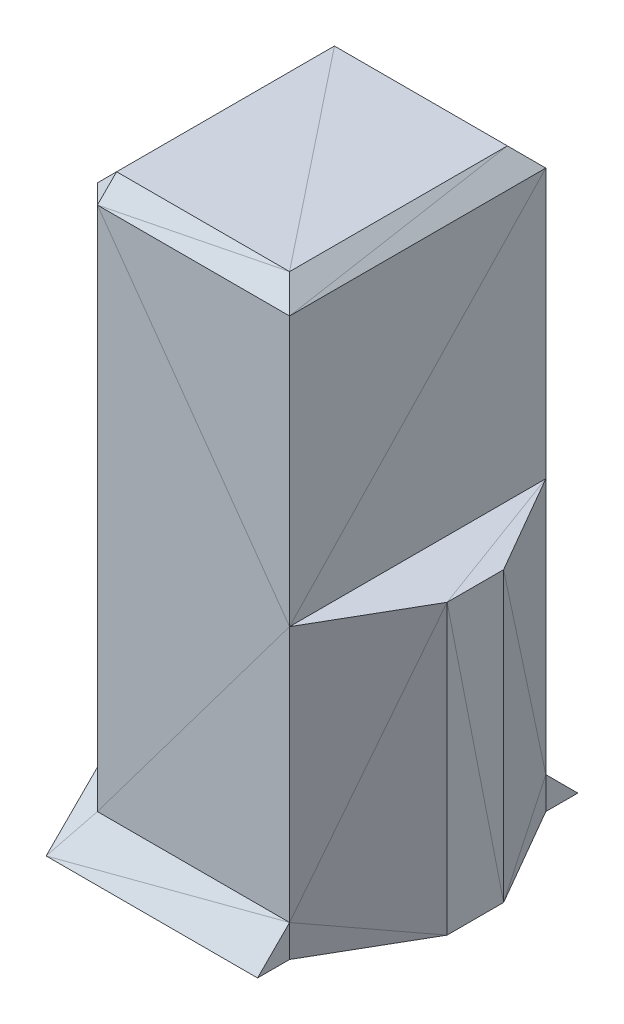
ISO-10303-21;
HEADER;
FILE_DESCRIPTION(('STEP AP214'),'2;1');
FILE_NAME('part.step','',(''),(''),'','','');
FILE_SCHEMA(('AUTOMOTIVE_DESIGN { 1 0 10303 214 1 1 1 1 }'));
ENDSEC;
DATA;
#1=APPLICATION_CONTEXT('core data for automotive mechanical design processes');
#2=APPLICATION_PROTOCOL_DEFINITION('international standard','automotive_design',2000,#1);
#3=PRODUCT_CONTEXT('',#1,'mechanical');
#4=PRODUCT('Part','Part','',(#3));
#5=PRODUCT_RELATED_PRODUCT_CATEGORY('part','',(#4));
#6=PRODUCT_DEFINITION_FORMATION('','',#4);
#7=PRODUCT_DEFINITION_CONTEXT('part definition',#1,'design');
#8=PRODUCT_DEFINITION('design','',#6,#7);
#9=PRODUCT_DEFINITION_SHAPE('','',#8);
#10=(LENGTH_UNIT() NAMED_UNIT(*) SI_UNIT(.MILLI.,.METRE.));
#11=(NAMED_UNIT(*) PLANE_ANGLE_UNIT() SI_UNIT($,.RADIAN.));
#12=(NAMED_UNIT(*) SI_UNIT($,.STERADIAN.) SOLID_ANGLE_UNIT());
#13=UNCERTAINTY_MEASURE_WITH_UNIT(LENGTH_MEASURE(1.E-05),#10,'distance_accuracy_value','');
#14=(GEOMETRIC_REPRESENTATION_CONTEXT(3) GLOBAL_UNCERTAINTY_ASSIGNED_CONTEXT((#13)) GLOBAL_UNIT_ASSIGNED_CONTEXT((#10,
#11,#12)) REPRESENTATION_CONTEXT('',''));
#15=CARTESIAN_POINT('',(0.,0.,0.));
#16=DIRECTION('',(0.,0.,1.));
#17=DIRECTION('',(1.,0.,0.));
#18=AXIS2_PLACEMENT_3D('',#15,#16,#17);
#19=CARTESIAN_POINT('',(-2.1,4.199999809265,-1.699999809265));
#20=DIRECTION('',(-0.707107062164992,0.707106500207992,0.));
#21=DIRECTION('',(0.,0.,1.));
#22=AXIS2_PLACEMENT_3D('',#19,#20,#21);
#23=PLANE('',#22);
#24=DIRECTION('',(-0.0875562486919108,-0.0875563182753708,-0.992304285209462));
#25=VECTOR('',#24,1.);
#26=CARTESIAN_POINT('',(-1.800000047684,4.5,1.700000107288));
#27=LINE('',#26,#25);
#28=CARTESIAN_POINT('',(-1.800000047684,4.5,1.700000107288));
#29=VERTEX_POINT('',#28);
#30=CARTESIAN_POINT('',(-2.1,4.199999809265,-1.699999809265));
#31=VERTEX_POINT('',#30);
#32=EDGE_CURVE('E10',#29,#31,#27,.T.);
#33=ORIENTED_EDGE('',*,*,#32,.F.);
#34=DIRECTION('',(0.,0.,1.));
#35=VECTOR('',#34,1.);
#36=CARTESIAN_POINT('',(-1.800000047684,4.5,-1.699999809265));
#37=LINE('',#36,#35);
#38=CARTESIAN_POINT('',(-1.800000047684,4.5,-1.699999809265));
#39=VERTEX_POINT('',#38);
#40=EDGE_CURVE('E272',#39,#29,#37,.T.);
#41=ORIENTED_EDGE('',*,*,#40,.F.);
#42=DIRECTION('',(0.707106500207992,0.707107062164992,0.));
#43=VECTOR('',#42,1.);
#44=CARTESIAN_POINT('',(-2.1,4.199999809265,-1.699999809265));
#45=LINE('',#44,#43);
#46=EDGE_CURVE('E38',#31,#39,#45,.T.);
#47=ORIENTED_EDGE('',*,*,#46,.F.);
#48=EDGE_LOOP('',(#33,#41,#47));
#49=FACE_BOUND('',#48,.T.);
#50=ADVANCED_FACE('F16',(#49),#23,.T.);
#51=CARTESIAN_POINT('',(-2.1,4.199999809265,1.700000107288));
#52=DIRECTION('',(-0.707107062164992,0.707106500207992,0.));
#53=DIRECTION('',(0.,0.,1.));
#54=AXIS2_PLACEMENT_3D('',#51,#52,#53);
#55=PLANE('',#54);
#56=DIRECTION('',(-0.707106500207992,-0.707107062164992,0.));
#57=VECTOR('',#56,1.);
#58=CARTESIAN_POINT('',(-1.800000047684,4.5,1.700000107288));
#59=LINE('',#58,#57);
#60=CARTESIAN_POINT('',(-2.1,4.199999809265,1.700000107288));
#61=VERTEX_POINT('',#60);
#62=EDGE_CURVE('E24',#29,#61,#59,.T.);
#63=ORIENTED_EDGE('',*,*,#62,.F.);
#64=ORIENTED_EDGE('',*,*,#32,.T.);
#65=DIRECTION('',(0.,0.,-1.));
#66=VECTOR('',#65,1.);
#67=CARTESIAN_POINT('',(-2.1,4.199999809265,1.700000107288));
#68=LINE('',#67,#66);
#69=EDGE_CURVE('E182',#61,#31,#68,.T.);
#70=ORIENTED_EDGE('',*,*,#69,.F.);
#71=EDGE_LOOP('',(#63,#64,#70));
#72=FACE_BOUND('',#71,.T.);
#73=ADVANCED_FACE('F189',(#72),#55,.T.);
#74=CARTESIAN_POINT('',(-1.800000047684,4.199999809265,2.000000149012));
#75=DIRECTION('',(-0.577350479489928,0.577350020652928,0.577350307425928));
#76=DIRECTION('',(0.707106500207351,0.707107062165632,0.));
#77=AXIS2_PLACEMENT_3D('',#74,#75,#76);
#78=PLANE('',#77);
#79=DIRECTION('',(0.,-0.707106956798026,0.707106605575026));
#80=VECTOR('',#79,1.);
#81=CARTESIAN_POINT('',(-1.800000047684,4.5,1.700000107288));
#82=LINE('',#81,#80);
#83=CARTESIAN_POINT('',(-1.800000047684,4.199999809265,2.000000149012));
#84=VERTEX_POINT('',#83);
#85=EDGE_CURVE('E154',#29,#84,#82,.T.);
#86=ORIENTED_EDGE('',*,*,#85,.F.);
#87=ORIENTED_EDGE('',*,*,#62,.T.);
#88=DIRECTION('',(-0.70710667581904,0.,-0.70710688655404));
#89=VECTOR('',#88,1.);
#90=CARTESIAN_POINT('',(-1.800000047684,4.199999809265,2.000000149012));
#91=LINE('',#90,#89);
#92=EDGE_CURVE('E155',#84,#61,#91,.T.);
#93=ORIENTED_EDGE('',*,*,#92,.F.);
#94=EDGE_LOOP('',(#86,#87,#93));
#95=FACE_BOUND('',#94,.T.);
#96=ADVANCED_FACE('F147',(#95),#78,.T.);
#97=CARTESIAN_POINT('',(-1.800000047684,4.199999809265,-2.));
#98=DIRECTION('',(-0.577350575080919,0.577350116243919,-0.577350116243919));
#99=DIRECTION('',(-0.707106500207398,0.,0.707107062165586));
#100=AXIS2_PLACEMENT_3D('',#97,#98,#99);
#101=PLANE('',#100);
#102=DIRECTION('',(0.707106500207992,0.,-0.707107062164992));
#103=VECTOR('',#102,1.);
#104=CARTESIAN_POINT('',(-2.1,4.199999809265,-1.699999809265));
#105=LINE('',#104,#103);
#106=CARTESIAN_POINT('',(-1.800000047684,4.199999809265,-2.));
#107=VERTEX_POINT('',#106);
#108=EDGE_CURVE('E290',#31,#107,#105,.T.);
#109=ORIENTED_EDGE('',*,*,#108,.F.);
#110=ORIENTED_EDGE('',*,*,#46,.T.);
#111=DIRECTION('',(0.,0.707106781186548,0.707106781186548));
#112=VECTOR('',#111,1.);
#113=CARTESIAN_POINT('',(-1.800000047684,4.199999809265,-2.));
#114=LINE('',#113,#112);
#115=EDGE_CURVE('E234',#107,#39,#114,.T.);
#116=ORIENTED_EDGE('',*,*,#115,.F.);
#117=EDGE_LOOP('',(#109,#110,#116));
#118=FACE_BOUND('',#117,.T.);
#119=ADVANCED_FACE('F548',(#118),#101,.T.);
#120=CARTESIAN_POINT('',(-1.800000047684,-4.,2.000000149012));
#121=DIRECTION('',(-0.70710688655404,0.,0.70710667581904));
#122=DIRECTION('',(0.,1.,0.));
#123=AXIS2_PLACEMENT_3D('',#120,#121,#122);
#124=PLANE('',#123);
#125=DIRECTION('',(0.0365364898834429,-0.99866419231808,0.036536500772163));
#126=VECTOR('',#125,1.);
#127=CARTESIAN_POINT('',(-2.1,4.199999809265,1.700000107288));
#128=LINE('',#127,#126);
#129=CARTESIAN_POINT('',(-1.800000047684,-4.,2.000000149012));
#130=VERTEX_POINT('',#129);
#131=EDGE_CURVE('E162',#61,#130,#128,.T.);
#132=ORIENTED_EDGE('',*,*,#131,.F.);
#133=DIRECTION('',(0.,1.,0.));
#134=VECTOR('',#133,1.);
#135=CARTESIAN_POINT('',(-2.1,-3.700000047684,1.700000107288));
#136=LINE('',#135,#134);
#137=CARTESIAN_POINT('',(-2.1,-3.700000047684,1.700000107288));
#138=VERTEX_POINT('',#137);
#139=EDGE_CURVE('E167',#138,#61,#136,.T.);
#140=ORIENTED_EDGE('',*,*,#139,.F.);
#141=DIRECTION('',(-0.577350211834954,0.577350211834954,-0.577350383898953));
#142=VECTOR('',#141,1.);
#143=CARTESIAN_POINT('',(-1.800000047684,-4.,2.000000149012));
#144=LINE('',#143,#142);
#145=EDGE_CURVE('E169',#130,#138,#144,.T.);
#146=ORIENTED_EDGE('',*,*,#145,.F.);
#147=EDGE_LOOP('',(#132,#140,#146));
#148=FACE_BOUND('',#147,.T.);
#149=ADVANCED_FACE('F163',(#148),#124,.T.);
#150=CARTESIAN_POINT('',(-1.800000047684,4.199999809265,2.000000149012));
#151=DIRECTION('',(-0.70710688655404,0.,0.70710667581904));
#152=DIRECTION('',(0.,1.,0.));
#153=AXIS2_PLACEMENT_3D('',#150,#151,#152);
#154=PLANE('',#153);
#155=ORIENTED_EDGE('',*,*,#92,.T.);
#156=ORIENTED_EDGE('',*,*,#131,.T.);
#157=DIRECTION('',(0.,-1.,0.));
#158=VECTOR('',#157,1.);
#159=CARTESIAN_POINT('',(-1.800000047684,4.199999809265,2.000000149012));
#160=LINE('',#159,#158);
#161=EDGE_CURVE('E176',#84,#130,#160,.T.);
#162=ORIENTED_EDGE('',*,*,#161,.F.);
#163=EDGE_LOOP('',(#155,#156,#162));
#164=FACE_BOUND('',#163,.T.);
#165=ADVANCED_FACE('F173',(#164),#154,.T.);
#166=CARTESIAN_POINT('',(0.9,4.5,1.700000107288));
#167=DIRECTION('',(0.,0.707106605575026,0.707106956798026));
#168=DIRECTION('',(1.,0.,0.));
#169=AXIS2_PLACEMENT_3D('',#166,#167,#168);
#170=PLANE('',#169);
#171=DIRECTION('',(0.987878331105138,0.109764326859015,-0.109764272339015));
#172=VECTOR('',#171,1.);
#173=CARTESIAN_POINT('',(-1.800000047684,4.199999809265,2.000000149012));
#174=LINE('',#173,#172);
#175=CARTESIAN_POINT('',(0.9,4.5,1.700000107288));
#176=VERTEX_POINT('',#175);
#177=EDGE_CURVE('E177',#84,#176,#174,.T.);
#178=ORIENTED_EDGE('',*,*,#177,.F.);
#179=DIRECTION('',(-1.,0.,0.));
#180=VECTOR('',#179,1.);
#181=CARTESIAN_POINT('',(1.199999952316,4.199999809265,2.000000149012));
#182=LINE('',#181,#180);
#183=CARTESIAN_POINT('',(1.199999952316,4.199999809265,2.000000149012));
#184=VERTEX_POINT('',#183);
#185=EDGE_CURVE('E320',#184,#84,#182,.T.);
#186=ORIENTED_EDGE('',*,*,#185,.F.);
#187=DIRECTION('',(0.577350058889262,-0.577350517726261,0.577350230953261));
#188=VECTOR('',#187,1.);
#189=CARTESIAN_POINT('',(0.9,4.5,1.700000107288));
#190=LINE('',#189,#188);
#191=EDGE_CURVE('E378',#176,#184,#190,.T.);
#192=ORIENTED_EDGE('',*,*,#191,.F.);
#193=EDGE_LOOP('',(#178,#186,#192));
#194=FACE_BOUND('',#193,.T.);
#195=ADVANCED_FACE('F409',(#194),#170,.T.);
#196=CARTESIAN_POINT('',(-1.800000047684,4.5,1.700000107288));
#197=DIRECTION('',(0.,0.707106605575026,0.707106956798026));
#198=DIRECTION('',(1.,0.,0.));
#199=AXIS2_PLACEMENT_3D('',#196,#197,#198);
#200=PLANE('',#199);
#201=ORIENTED_EDGE('',*,*,#85,.T.);
#202=ORIENTED_EDGE('',*,*,#177,.T.);
#203=DIRECTION('',(1.,0.,0.));
#204=VECTOR('',#203,1.);
#205=CARTESIAN_POINT('',(-1.800000047684,4.5,1.700000107288));
#206=LINE('',#205,#204);
#207=EDGE_CURVE('E273',#29,#176,#206,.T.);
#208=ORIENTED_EDGE('',*,*,#207,.F.);
#209=EDGE_LOOP('',(#201,#202,#208));
#210=FACE_BOUND('',#209,.T.);
#211=ADVANCED_FACE('F399',(#210),#200,.T.);
#212=CARTESIAN_POINT('',(1.199999952316,4.199999809265,-2.));
#213=DIRECTION('',(0.,0.707106781186548,-0.707106781186548));
#214=DIRECTION('',(-1.,0.,0.));
#215=AXIS2_PLACEMENT_3D('',#212,#213,#214);
#216=PLANE('',#215);
#217=DIRECTION('',(0.990147530633161,-0.0990148160152161,-0.0990148160152161));
#218=VECTOR('',#217,1.);
#219=CARTESIAN_POINT('',(-1.800000047684,4.5,-1.699999809265));
#220=LINE('',#219,#218);
#221=CARTESIAN_POINT('',(1.199999952316,4.199999809265,-2.));
#222=VERTEX_POINT('',#221);
#223=EDGE_CURVE('E237',#39,#222,#220,.T.);
#224=ORIENTED_EDGE('',*,*,#223,.F.);
#225=DIRECTION('',(-1.,0.,0.));
#226=VECTOR('',#225,1.);
#227=CARTESIAN_POINT('',(0.9,4.5,-1.699999809265));
#228=LINE('',#227,#226);
#229=CARTESIAN_POINT('',(0.9,4.5,-1.699999809265));
#230=VERTEX_POINT('',#229);
#231=EDGE_CURVE('E295',#230,#39,#228,.T.);
#232=ORIENTED_EDGE('',*,*,#231,.F.);
#233=DIRECTION('',(-0.577349963298919,0.577350422134919,0.577350422134919));
#234=VECTOR('',#233,1.);
#235=CARTESIAN_POINT('',(1.199999952316,4.199999809265,-2.));
#236=LINE('',#235,#234);
#237=EDGE_CURVE('E372',#222,#230,#236,.T.);
#238=ORIENTED_EDGE('',*,*,#237,.F.);
#239=EDGE_LOOP('',(#224,#232,#238));
#240=FACE_BOUND('',#239,.T.);
#241=ADVANCED_FACE('F560',(#240),#216,.T.);
#242=CARTESIAN_POINT('',(-1.800000047684,4.199999809265,-2.));
#243=DIRECTION('',(0.,0.707106781186548,-0.707106781186548));
#244=DIRECTION('',(-1.,0.,0.));
#245=AXIS2_PLACEMENT_3D('',#242,#243,#244);
#246=PLANE('',#245);
#247=ORIENTED_EDGE('',*,*,#115,.T.);
#248=ORIENTED_EDGE('',*,*,#223,.T.);
#249=DIRECTION('',(1.,0.,0.));
#250=VECTOR('',#249,1.);
#251=CARTESIAN_POINT('',(-1.800000047684,4.199999809265,-2.));
#252=LINE('',#251,#250);
#253=EDGE_CURVE('E257',#107,#222,#252,.T.);
#254=ORIENTED_EDGE('',*,*,#253,.F.);
#255=EDGE_LOOP('',(#247,#248,#254));
#256=FACE_BOUND('',#255,.T.);
#257=ADVANCED_FACE('F563',(#256),#246,.T.);
#258=CARTESIAN_POINT('',(-2.1,-3.700000047684,-1.699999809265));
#259=DIRECTION('',(-0.707107062164992,0.,-0.707106500207992));
#260=DIRECTION('',(-0.707106500207992,0.,0.707107062164992));
#261=AXIS2_PLACEMENT_3D('',#258,#259,#260);
#262=PLANE('',#261);
#263=DIRECTION('',(-0.0379200339469579,-0.998561034571946,0.037920064083098));
#264=VECTOR('',#263,1.);
#265=CARTESIAN_POINT('',(-1.800000047684,4.199999809265,-2.));
#266=LINE('',#265,#264);
#267=CARTESIAN_POINT('',(-2.1,-3.700000047684,-1.699999809265));
#268=VERTEX_POINT('',#267);
#269=EDGE_CURVE('E239',#107,#268,#266,.T.);
#270=ORIENTED_EDGE('',*,*,#269,.F.);
#271=DIRECTION('',(0.,1.,0.));
#272=VECTOR('',#271,1.);
#273=CARTESIAN_POINT('',(-1.800000047684,-4.,-2.));
#274=LINE('',#273,#272);
#275=CARTESIAN_POINT('',(-1.800000047684,-4.,-2.));
#276=VERTEX_POINT('',#275);
#277=EDGE_CURVE('E268',#276,#107,#274,.T.);
#278=ORIENTED_EDGE('',*,*,#277,.F.);
#279=DIRECTION('',(0.577350116243919,-0.577350116243919,-0.577350575080919));
#280=VECTOR('',#279,1.);
#281=CARTESIAN_POINT('',(-2.1,-3.700000047684,-1.699999809265));
#282=LINE('',#281,#280);
#283=EDGE_CURVE('E344',#268,#276,#282,.T.);
#284=ORIENTED_EDGE('',*,*,#283,.F.);
#285=EDGE_LOOP('',(#270,#278,#284));
#286=FACE_BOUND('',#285,.T.);
#287=ADVANCED_FACE('F562',(#286),#262,.T.);
#288=CARTESIAN_POINT('',(-2.1,4.199999809265,-1.699999809265));
#289=DIRECTION('',(-0.707107062164992,0.,-0.707106500207992));
#290=DIRECTION('',(-0.707106500207992,0.,0.707107062164992));
#291=AXIS2_PLACEMENT_3D('',#288,#289,#290);
#292=PLANE('',#291);
#293=ORIENTED_EDGE('',*,*,#108,.T.);
#294=ORIENTED_EDGE('',*,*,#269,.T.);
#295=DIRECTION('',(0.,-1.,0.));
#296=VECTOR('',#295,1.);
#297=CARTESIAN_POINT('',(-2.1,4.199999809265,-1.699999809265));
#298=LINE('',#297,#296);
#299=EDGE_CURVE('E187',#31,#268,#298,.T.);
#300=ORIENTED_EDGE('',*,*,#299,.F.);
#301=EDGE_LOOP('',(#293,#294,#300));
#302=FACE_BOUND('',#301,.T.);
#303=ADVANCED_FACE('F566',(#302),#292,.T.);
#304=CARTESIAN_POINT('',(-1.800000047684,4.5,-1.699999809265));
#305=DIRECTION('',(0.,1.,0.));
#306=DIRECTION('',(0.,0.,-1.));
#307=AXIS2_PLACEMENT_3D('',#304,#305,#306);
#308=PLANE('',#307);
#309=DIRECTION('',(-0.621882159696826,0.,-0.78311083471678));
#310=VECTOR('',#309,1.);
#311=CARTESIAN_POINT('',(0.9,4.5,1.700000107288));
#312=LINE('',#311,#310);
#313=EDGE_CURVE('E267',#176,#39,#312,.T.);
#314=ORIENTED_EDGE('',*,*,#313,.F.);
#315=DIRECTION('',(0.,0.,-1.));
#316=VECTOR('',#315,1.);
#317=CARTESIAN_POINT('',(0.9,4.5,1.700000107288));
#318=LINE('',#317,#316);
#319=EDGE_CURVE('E373',#176,#230,#318,.T.);
#320=ORIENTED_EDGE('',*,*,#319,.T.);
#321=ORIENTED_EDGE('',*,*,#231,.T.);
#322=EDGE_LOOP('',(#314,#320,#321));
#323=FACE_BOUND('',#322,.T.);
#324=ADVANCED_FACE('F404',(#323),#308,.T.);
#325=CARTESIAN_POINT('',(-1.800000047684,4.5,1.700000107288));
#326=DIRECTION('',(0.,1.,0.));
#327=DIRECTION('',(0.,0.,-1.));
#328=AXIS2_PLACEMENT_3D('',#325,#326,#327);
#329=PLANE('',#328);
#330=ORIENTED_EDGE('',*,*,#207,.T.);
#331=ORIENTED_EDGE('',*,*,#313,.T.);
#332=ORIENTED_EDGE('',*,*,#40,.T.);
#333=EDGE_LOOP('',(#330,#331,#332));
#334=FACE_BOUND('',#333,.T.);
#335=ADVANCED_FACE('F408',(#334),#329,.T.);
#336=CARTESIAN_POINT('',(1.199999952316,4.199999809265,2.000000149012));
#337=DIRECTION('',(0.707107062164992,0.707106500207992,0.));
#338=DIRECTION('',(0.,0.,-1.));
#339=AXIS2_PLACEMENT_3D('',#336,#337,#338);
#340=PLANE('',#339);
#341=DIRECTION('',(0.0805532298748672,-0.0805532938928272,0.993489981831595));
#342=VECTOR('',#341,1.);
#343=CARTESIAN_POINT('',(0.9,4.5,-1.699999809265));
#344=LINE('',#343,#342);
#345=EDGE_CURVE('E369',#230,#184,#344,.T.);
#346=ORIENTED_EDGE('',*,*,#345,.F.);
#347=ORIENTED_EDGE('',*,*,#319,.F.);
#348=ORIENTED_EDGE('',*,*,#191,.T.);
#349=EDGE_LOOP('',(#346,#347,#348));
#350=FACE_BOUND('',#349,.T.);
#351=ADVANCED_FACE('F415',(#350),#340,.T.);
#352=CARTESIAN_POINT('',(1.199999952316,4.199999809265,-2.));
#353=DIRECTION('',(0.707107062164992,0.707106500207992,0.));
#354=DIRECTION('',(0.,0.,-1.));
#355=AXIS2_PLACEMENT_3D('',#352,#353,#354);
#356=PLANE('',#355);
#357=ORIENTED_EDGE('',*,*,#237,.T.);
#358=ORIENTED_EDGE('',*,*,#345,.T.);
#359=DIRECTION('',(0.,0.,1.));
#360=VECTOR('',#359,1.);
#361=CARTESIAN_POINT('',(1.199999952316,4.199999809265,-2.));
#362=LINE('',#361,#360);
#363=EDGE_CURVE('E298',#222,#184,#362,.T.);
#364=ORIENTED_EDGE('',*,*,#363,.F.);
#365=EDGE_LOOP('',(#357,#358,#364));
#366=FACE_BOUND('',#365,.T.);
#367=ADVANCED_FACE('F417',(#366),#356,.T.);
#368=CARTESIAN_POINT('',(2.100000286102,0.,0.441154241562));
#369=DIRECTION('',(0.,1.,0.));
#370=DIRECTION('',(0.,0.,-1.));
#371=AXIS2_PLACEMENT_3D('',#368,#369,#370);
#372=PLANE('',#371);
#373=DIRECTION('',(0.345917781251056,0.,0.938264828614153));
#374=VECTOR('',#373,1.);
#375=CARTESIAN_POINT('',(1.199999952316,0.,-2.));
#376=LINE('',#375,#374);
#377=CARTESIAN_POINT('',(1.199999952316,0.,-2.));
#378=VERTEX_POINT('',#377);
#379=CARTESIAN_POINT('',(2.100000286102,0.,0.441154241562));
#380=VERTEX_POINT('',#379);
#381=EDGE_CURVE('E366',#378,#380,#376,.T.);
#382=ORIENTED_EDGE('',*,*,#381,.F.);
#383=DIRECTION('',(0.,0.,-1.));
#384=VECTOR('',#383,1.);
#385=CARTESIAN_POINT('',(1.199999952316,0.,2.000000149012));
#386=LINE('',#385,#384);
#387=CARTESIAN_POINT('',(1.199999952316,0.,2.000000149012));
#388=VERTEX_POINT('',#387);
#389=EDGE_CURVE('E303',#388,#378,#386,.T.);
#390=ORIENTED_EDGE('',*,*,#389,.F.);
#391=DIRECTION('',(-0.500000095622769,0.,0.8660253485766));
#392=VECTOR('',#391,1.);
#393=CARTESIAN_POINT('',(2.100000286102,0.,0.441154241562));
#394=LINE('',#393,#392);
#395=EDGE_CURVE('E355',#380,#388,#394,.T.);
#396=ORIENTED_EDGE('',*,*,#395,.F.);
#397=EDGE_LOOP('',(#382,#390,#396));
#398=FACE_BOUND('',#397,.T.);
#399=ADVANCED_FACE('F484',(#398),#372,.T.);
#400=CARTESIAN_POINT('',(2.100000286102,0.,-0.441154241562));
#401=DIRECTION('',(0.,1.,0.));
#402=DIRECTION('',(0.,0.,-1.));
#403=AXIS2_PLACEMENT_3D('',#400,#401,#402);
#404=PLANE('',#403);
#405=DIRECTION('',(0.500000131468897,0.,0.866025327880822));
#406=VECTOR('',#405,1.);
#407=CARTESIAN_POINT('',(1.199999952316,0.,-2.));
#408=LINE('',#407,#406);
#409=CARTESIAN_POINT('',(2.100000286102,0.,-0.441154241562));
#410=VERTEX_POINT('',#409);
#411=EDGE_CURVE('E353',#378,#410,#408,.T.);
#412=ORIENTED_EDGE('',*,*,#411,.F.);
#413=ORIENTED_EDGE('',*,*,#381,.T.);
#414=DIRECTION('',(0.,0.,1.));
#415=VECTOR('',#414,1.);
#416=CARTESIAN_POINT('',(2.100000286102,0.,-0.441154241562));
#417=LINE('',#416,#415);
#418=EDGE_CURVE('E365',#410,#380,#417,.T.);
#419=ORIENTED_EDGE('',*,*,#418,.F.);
#420=EDGE_LOOP('',(#412,#413,#419));
#421=FACE_BOUND('',#420,.T.);
#422=ADVANCED_FACE('F579',(#421),#404,.T.);
#423=CARTESIAN_POINT('',(2.100000286102,0.,0.441154241562));
#424=DIRECTION('',(1.,0.,0.));
#425=DIRECTION('',(0.,1.,0.));
#426=AXIS2_PLACEMENT_3D('',#423,#424,#425);
#427=PLANE('',#426);
#428=DIRECTION('',(0.,0.981315580227493,0.192405124679097));
#429=VECTOR('',#428,1.);
#430=CARTESIAN_POINT('',(2.100000286102,-4.5,-0.441154241562));
#431=LINE('',#430,#429);
#432=CARTESIAN_POINT('',(2.100000286102,-4.5,-0.441154241562));
#433=VERTEX_POINT('',#432);
#434=EDGE_CURVE('E361',#433,#380,#431,.T.);
#435=ORIENTED_EDGE('',*,*,#434,.F.);
#436=DIRECTION('',(0.,-1.,0.));
#437=VECTOR('',#436,1.);
#438=CARTESIAN_POINT('',(2.100000286102,0.,-0.441154241562));
#439=LINE('',#438,#437);
#440=EDGE_CURVE('E252',#410,#433,#439,.T.);
#441=ORIENTED_EDGE('',*,*,#440,.F.);
#442=ORIENTED_EDGE('',*,*,#418,.T.);
#443=EDGE_LOOP('',(#435,#441,#442));
#444=FACE_BOUND('',#443,.T.);
#445=ADVANCED_FACE('F584',(#444),#427,.T.);
#446=CARTESIAN_POINT('',(2.100000286102,-4.5,0.441154241562));
#447=DIRECTION('',(1.,0.,0.));
#448=DIRECTION('',(0.,1.,0.));
#449=AXIS2_PLACEMENT_3D('',#446,#447,#448);
#450=PLANE('',#449);
#451=DIRECTION('',(0.,0.,1.));
#452=VECTOR('',#451,1.);
#453=CARTESIAN_POINT('',(2.100000286102,-4.5,-0.441154241562));
#454=LINE('',#453,#452);
#455=CARTESIAN_POINT('',(2.100000286102,-4.5,0.441154241562));
#456=VERTEX_POINT('',#455);
#457=EDGE_CURVE('E429',#433,#456,#454,.T.);
#458=ORIENTED_EDGE('',*,*,#457,.F.);
#459=ORIENTED_EDGE('',*,*,#434,.T.);
#460=DIRECTION('',(0.,1.,0.));
#461=VECTOR('',#460,1.);
#462=CARTESIAN_POINT('',(2.100000286102,-4.5,0.441154241562));
#463=LINE('',#462,#461);
#464=EDGE_CURVE('E352',#456,#380,#463,.T.);
#465=ORIENTED_EDGE('',*,*,#464,.F.);
#466=EDGE_LOOP('',(#458,#459,#465));
#467=FACE_BOUND('',#466,.T.);
#468=ADVANCED_FACE('F480',(#467),#450,.T.);
#469=CARTESIAN_POINT('',(1.199999952316,-4.,-2.));
#470=DIRECTION('',(0.866025327880822,0.,-0.500000131468897));
#471=DIRECTION('',(0.,-1.,0.));
#472=AXIS2_PLACEMENT_3D('',#469,#470,#471);
#473=PLANE('',#472);
#474=DIRECTION('',(-0.481759085212874,0.26764383696693,-0.834430920057781));
#475=VECTOR('',#474,1.);
#476=CARTESIAN_POINT('',(2.100000286102,-4.5,-0.441154241562));
#477=LINE('',#476,#475);
#478=CARTESIAN_POINT('',(1.199999952316,-4.,-2.));
#479=VERTEX_POINT('',#478);
#480=EDGE_CURVE('E258',#433,#479,#477,.T.);
#481=ORIENTED_EDGE('',*,*,#480,.F.);
#482=DIRECTION('',(0.500000131468897,0.,0.866025327880822));
#483=VECTOR('',#482,1.);
#484=CARTESIAN_POINT('',(1.199999952316,-4.5,-2.));
#485=LINE('',#484,#483);
#486=CARTESIAN_POINT('',(1.199999952316,-4.5,-2.));
#487=VERTEX_POINT('',#486);
#488=EDGE_CURVE('E451',#487,#433,#485,.T.);
#489=ORIENTED_EDGE('',*,*,#488,.F.);
#490=DIRECTION('',(0.,-1.,0.));
#491=VECTOR('',#490,1.);
#492=CARTESIAN_POINT('',(1.199999952316,-4.,-2.));
#493=LINE('',#492,#491);
#494=EDGE_CURVE('E232',#479,#487,#493,.T.);
#495=ORIENTED_EDGE('',*,*,#494,.F.);
#496=EDGE_LOOP('',(#481,#489,#495));
#497=FACE_BOUND('',#496,.T.);
#498=ADVANCED_FACE('F589',(#497),#473,.T.);
#499=CARTESIAN_POINT('',(1.199999952316,-4.,-2.));
#500=DIRECTION('',(0.866025327880822,0.,-0.500000131468897));
#501=DIRECTION('',(0.,-1.,0.));
#502=AXIS2_PLACEMENT_3D('',#499,#500,#501);
#503=PLANE('',#502);
#504=DIRECTION('',(-0.205182411031987,-0.911921488599943,-0.355386236132978));
#505=VECTOR('',#504,1.);
#506=CARTESIAN_POINT('',(2.100000286102,0.,-0.441154241562));
#507=LINE('',#506,#505);
#508=EDGE_CURVE('E260',#410,#479,#507,.T.);
#509=ORIENTED_EDGE('',*,*,#508,.F.);
#510=ORIENTED_EDGE('',*,*,#440,.T.);
#511=ORIENTED_EDGE('',*,*,#480,.T.);
#512=EDGE_LOOP('',(#509,#510,#511));
#513=FACE_BOUND('',#512,.T.);
#514=ADVANCED_FACE('F595',(#513),#503,.T.);
#515=CARTESIAN_POINT('',(1.199999952316,0.,-2.));
#516=DIRECTION('',(0.866025327880822,0.,-0.500000131468897));
#517=DIRECTION('',(0.,-1.,0.));
#518=AXIS2_PLACEMENT_3D('',#515,#516,#517);
#519=PLANE('',#518);
#520=ORIENTED_EDGE('',*,*,#411,.T.);
#521=ORIENTED_EDGE('',*,*,#508,.T.);
#522=DIRECTION('',(0.,-1.,0.));
#523=VECTOR('',#522,1.);
#524=CARTESIAN_POINT('',(1.199999952316,0.,-2.));
#525=LINE('',#524,#523);
#526=EDGE_CURVE('E307',#378,#479,#525,.T.);
#527=ORIENTED_EDGE('',*,*,#526,.F.);
#528=EDGE_LOOP('',(#520,#521,#527));
#529=FACE_BOUND('',#528,.T.);
#530=ADVANCED_FACE('F596',(#529),#519,.T.);
#531=CARTESIAN_POINT('',(1.199999952316,-4.,2.000000149012));
#532=DIRECTION('',(0.8660253485766,0.,0.500000095622769));
#533=DIRECTION('',(0.,-1.,0.));
#534=AXIS2_PLACEMENT_3D('',#531,#532,#533);
#535=PLANE('',#534);
#536=DIRECTION('',(-0.205182408554086,-0.911921477590379,0.355386265814148));
#537=VECTOR('',#536,1.);
#538=CARTESIAN_POINT('',(2.100000286102,0.,0.441154241562));
#539=LINE('',#538,#537);
#540=CARTESIAN_POINT('',(1.199999952316,-4.,2.000000149012));
#541=VERTEX_POINT('',#540);
#542=EDGE_CURVE('E347',#380,#541,#539,.T.);
#543=ORIENTED_EDGE('',*,*,#542,.F.);
#544=ORIENTED_EDGE('',*,*,#395,.T.);
#545=DIRECTION('',(0.,1.,0.));
#546=VECTOR('',#545,1.);
#547=CARTESIAN_POINT('',(1.199999952316,-4.,2.000000149012));
#548=LINE('',#547,#546);
#549=EDGE_CURVE('E332',#541,#388,#548,.T.);
#550=ORIENTED_EDGE('',*,*,#549,.F.);
#551=EDGE_LOOP('',(#543,#544,#550));
#552=FACE_BOUND('',#551,.T.);
#553=ADVANCED_FACE('F489',(#552),#535,.T.);
#554=CARTESIAN_POINT('',(1.199999952316,-4.,2.000000149012));
#555=DIRECTION('',(0.8660253485766,0.,0.500000095622769));
#556=DIRECTION('',(0.,-1.,0.));
#557=AXIS2_PLACEMENT_3D('',#554,#555,#556);
#558=PLANE('',#557);
#559=DIRECTION('',(-0.48175905314798,0.267643819153988,0.834430944283965));
#560=VECTOR('',#559,1.);
#561=CARTESIAN_POINT('',(2.100000286102,-4.5,0.441154241562));
#562=LINE('',#561,#560);
#563=EDGE_CURVE('E348',#456,#541,#562,.T.);
#564=ORIENTED_EDGE('',*,*,#563,.F.);
#565=ORIENTED_EDGE('',*,*,#464,.T.);
#566=ORIENTED_EDGE('',*,*,#542,.T.);
#567=EDGE_LOOP('',(#564,#565,#566));
#568=FACE_BOUND('',#567,.T.);
#569=ADVANCED_FACE('F471',(#568),#558,.T.);
#570=CARTESIAN_POINT('',(1.199999952316,-4.5,2.000000149012));
#571=DIRECTION('',(0.8660253485766,0.,0.500000095622769));
#572=DIRECTION('',(0.,-1.,0.));
#573=AXIS2_PLACEMENT_3D('',#570,#571,#572);
#574=PLANE('',#573);
#575=DIRECTION('',(-0.500000095622769,0.,0.8660253485766));
#576=VECTOR('',#575,1.);
#577=CARTESIAN_POINT('',(2.100000286102,-4.5,0.441154241562));
#578=LINE('',#577,#576);
#579=CARTESIAN_POINT('',(1.199999952316,-4.5,2.000000149012));
#580=VERTEX_POINT('',#579);
#581=EDGE_CURVE('E511',#456,#580,#578,.T.);
#582=ORIENTED_EDGE('',*,*,#581,.F.);
#583=ORIENTED_EDGE('',*,*,#563,.T.);
#584=DIRECTION('',(0.,1.,0.));
#585=VECTOR('',#584,1.);
#586=CARTESIAN_POINT('',(1.199999952316,-4.5,2.000000149012));
#587=LINE('',#586,#585);
#588=EDGE_CURVE('E439',#580,#541,#587,.T.);
#589=ORIENTED_EDGE('',*,*,#588,.F.);
#590=EDGE_LOOP('',(#582,#583,#589));
#591=FACE_BOUND('',#590,.T.);
#592=ADVANCED_FACE('F509',(#591),#574,.T.);
#593=CARTESIAN_POINT('',(-1.800000047684,-4.,-2.));
#594=DIRECTION('',(-3.51223762106398E-07,0.707106886553996,-0.707106675818996));
#595=DIRECTION('',(-0.999999999999877,0.,4.96705481813695E-07));
#596=AXIS2_PLACEMENT_3D('',#593,#594,#595);
#597=PLANE('',#596);
#598=DIRECTION('',(0.390566680332979,0.650944570686966,0.650944570686966));
#599=VECTOR('',#598,1.);
#600=CARTESIAN_POINT('',(-2.1,-4.5,-2.5));
#601=LINE('',#600,#599);
#602=CARTESIAN_POINT('',(-2.1,-4.5,-2.5));
#603=VERTEX_POINT('',#602);
#604=EDGE_CURVE('E341',#603,#276,#601,.T.);
#605=ORIENTED_EDGE('',*,*,#604,.F.);
#606=DIRECTION('',(0.,-0.70710667581904,-0.70710688655404));
#607=VECTOR('',#606,1.);
#608=CARTESIAN_POINT('',(-2.1,-3.700000047684,-1.699999809265));
#609=LINE('',#608,#607);
#610=EDGE_CURVE('E209',#268,#603,#609,.T.);
#611=ORIENTED_EDGE('',*,*,#610,.F.);
#612=ORIENTED_EDGE('',*,*,#283,.T.);
#613=EDGE_LOOP('',(#605,#611,#612));
#614=FACE_BOUND('',#613,.T.);
#615=ADVANCED_FACE('F604',(#614),#597,.T.);
#616=CARTESIAN_POINT('',(-1.800000047684,-4.,-2.));
#617=DIRECTION('',(0.,0.707106781186548,-0.707106781186548));
#618=DIRECTION('',(-1.,0.,0.));
#619=AXIS2_PLACEMENT_3D('',#616,#617,#618);
#620=PLANE('',#619);
#621=DIRECTION('',(-0.973328526784523,0.162221421130921,0.162221421130921));
#622=VECTOR('',#621,1.);
#623=CARTESIAN_POINT('',(1.199999952316,-4.5,-2.5));
#624=LINE('',#623,#622);
#625=CARTESIAN_POINT('',(1.199999952316,-4.5,-2.5));
#626=VERTEX_POINT('',#625);
#627=EDGE_CURVE('E337',#626,#276,#624,.T.);
#628=ORIENTED_EDGE('',*,*,#627,.F.);
#629=DIRECTION('',(1.,0.,0.));
#630=VECTOR('',#629,1.);
#631=CARTESIAN_POINT('',(-2.1,-4.5,-2.5));
#632=LINE('',#631,#630);
#633=EDGE_CURVE('E225',#603,#626,#632,.T.);
#634=ORIENTED_EDGE('',*,*,#633,.F.);
#635=ORIENTED_EDGE('',*,*,#604,.T.);
#636=EDGE_LOOP('',(#628,#634,#635));
#637=FACE_BOUND('',#636,.T.);
#638=ADVANCED_FACE('F609',(#637),#620,.T.);
#639=CARTESIAN_POINT('',(1.199999952316,-4.,-2.));
#640=DIRECTION('',(0.,0.707106781186548,-0.707106781186548));
#641=DIRECTION('',(-1.,0.,0.));
#642=AXIS2_PLACEMENT_3D('',#639,#640,#641);
#643=PLANE('',#642);
#644=DIRECTION('',(0.,0.707106781186548,0.707106781186548));
#645=VECTOR('',#644,1.);
#646=CARTESIAN_POINT('',(1.199999952316,-4.5,-2.5));
#647=LINE('',#646,#645);
#648=EDGE_CURVE('E230',#626,#479,#647,.T.);
#649=ORIENTED_EDGE('',*,*,#648,.F.);
#650=ORIENTED_EDGE('',*,*,#627,.T.);
#651=DIRECTION('',(-1.,0.,0.));
#652=VECTOR('',#651,1.);
#653=CARTESIAN_POINT('',(1.199999952316,-4.,-2.));
#654=LINE('',#653,#652);
#655=EDGE_CURVE('E311',#479,#276,#654,.T.);
#656=ORIENTED_EDGE('',*,*,#655,.F.);
#657=EDGE_LOOP('',(#649,#650,#656));
#658=FACE_BOUND('',#657,.T.);
#659=ADVANCED_FACE('F612',(#658),#643,.T.);
#660=CARTESIAN_POINT('',(-2.1,-4.5,2.5));
#661=DIRECTION('',(-2.63417849589008E-07,0.707106754845023,0.707106807528023));
#662=DIRECTION('',(0.999999999999931,3.72529109337562E-07,0.));
#663=AXIS2_PLACEMENT_3D('',#660,#661,#662);
#664=PLANE('',#663);
#665=DIRECTION('',(-0.390566729654078,-0.65094465288913,0.65094445889213));
#666=VECTOR('',#665,1.);
#667=CARTESIAN_POINT('',(-1.800000047684,-4.,2.000000149012));
#668=LINE('',#667,#666);
#669=CARTESIAN_POINT('',(-2.1,-4.5,2.5));
#670=VERTEX_POINT('',#669);
#671=EDGE_CURVE('E253',#130,#670,#668,.T.);
#672=ORIENTED_EDGE('',*,*,#671,.F.);
#673=ORIENTED_EDGE('',*,*,#145,.T.);
#674=DIRECTION('',(0.,0.707106807528047,-0.707106754845047));
#675=VECTOR('',#674,1.);
#676=CARTESIAN_POINT('',(-2.1,-4.5,2.5));
#677=LINE('',#676,#675);
#678=EDGE_CURVE('E217',#670,#138,#677,.T.);
#679=ORIENTED_EDGE('',*,*,#678,.F.);
#680=EDGE_LOOP('',(#672,#673,#679));
#681=FACE_BOUND('',#680,.T.);
#682=ADVANCED_FACE('F616',(#681),#664,.T.);
#683=CARTESIAN_POINT('',(1.199999952316,0.,2.000000149012));
#684=DIRECTION('',(0.,0.,1.));
#685=DIRECTION('',(0.,-1.,0.));
#686=AXIS2_PLACEMENT_3D('',#683,#684,#685);
#687=PLANE('',#686);
#688=DIRECTION('',(0.6,0.8,0.));
#689=VECTOR('',#688,1.);
#690=CARTESIAN_POINT('',(-1.800000047684,-4.,2.000000149012));
#691=LINE('',#690,#689);
#692=EDGE_CURVE('E330',#130,#388,#691,.T.);
#693=ORIENTED_EDGE('',*,*,#692,.F.);
#694=DIRECTION('',(1.,0.,0.));
#695=VECTOR('',#694,1.);
#696=CARTESIAN_POINT('',(-1.800000047684,-4.,2.000000149012));
#697=LINE('',#696,#695);
#698=EDGE_CURVE('E250',#130,#541,#697,.T.);
#699=ORIENTED_EDGE('',*,*,#698,.T.);
#700=ORIENTED_EDGE('',*,*,#549,.T.);
#701=EDGE_LOOP('',(#693,#699,#700));
#702=FACE_BOUND('',#701,.T.);
#703=ADVANCED_FACE('F493',(#702),#687,.T.);
#704=CARTESIAN_POINT('',(1.199999952316,0.,2.000000149012));
#705=DIRECTION('',(0.,0.,1.));
#706=DIRECTION('',(0.,-1.,0.));
#707=AXIS2_PLACEMENT_3D('',#704,#705,#706);
#708=PLANE('',#707);
#709=DIRECTION('',(0.581238211197245,-0.813733458722343,0.));
#710=VECTOR('',#709,1.);
#711=CARTESIAN_POINT('',(-1.800000047684,4.199999809265,2.000000149012));
#712=LINE('',#711,#710);
#713=EDGE_CURVE('E321',#84,#388,#712,.T.);
#714=ORIENTED_EDGE('',*,*,#713,.F.);
#715=ORIENTED_EDGE('',*,*,#161,.T.);
#716=ORIENTED_EDGE('',*,*,#692,.T.);
#717=EDGE_LOOP('',(#714,#715,#716));
#718=FACE_BOUND('',#717,.T.);
#719=ADVANCED_FACE('F623',(#718),#708,.T.);
#720=CARTESIAN_POINT('',(1.199999952316,4.199999809265,2.000000149012));
#721=DIRECTION('',(0.,0.,1.));
#722=DIRECTION('',(0.,-1.,0.));
#723=AXIS2_PLACEMENT_3D('',#720,#721,#722);
#724=PLANE('',#723);
#725=ORIENTED_EDGE('',*,*,#185,.T.);
#726=ORIENTED_EDGE('',*,*,#713,.T.);
#727=DIRECTION('',(0.,-1.,0.));
#728=VECTOR('',#727,1.);
#729=CARTESIAN_POINT('',(1.199999952316,4.199999809265,2.000000149012));
#730=LINE('',#729,#728);
#731=EDGE_CURVE('E286',#184,#388,#730,.T.);
#732=ORIENTED_EDGE('',*,*,#731,.F.);
#733=EDGE_LOOP('',(#725,#726,#732));
#734=FACE_BOUND('',#733,.T.);
#735=ADVANCED_FACE('F626',(#734),#724,.T.);
#736=CARTESIAN_POINT('',(-1.800000047684,-4.,-2.));
#737=DIRECTION('',(0.,0.,-1.));
#738=DIRECTION('',(-1.,0.,0.));
#739=AXIS2_PLACEMENT_3D('',#736,#737,#738);
#740=PLANE('',#739);
#741=DIRECTION('',(-0.6,-0.8,0.));
#742=VECTOR('',#741,1.);
#743=CARTESIAN_POINT('',(1.199999952316,0.,-2.));
#744=LINE('',#743,#742);
#745=EDGE_CURVE('E282',#378,#276,#744,.T.);
#746=ORIENTED_EDGE('',*,*,#745,.F.);
#747=ORIENTED_EDGE('',*,*,#526,.T.);
#748=ORIENTED_EDGE('',*,*,#655,.T.);
#749=EDGE_LOOP('',(#746,#747,#748));
#750=FACE_BOUND('',#749,.T.);
#751=ADVANCED_FACE('F627',(#750),#740,.T.);
#752=CARTESIAN_POINT('',(1.199999952316,4.199999809265,-2.));
#753=DIRECTION('',(1.,0.,0.));
#754=DIRECTION('',(0.,1.,0.));
#755=AXIS2_PLACEMENT_3D('',#752,#753,#754);
#756=PLANE('',#755);
#757=DIRECTION('',(0.,0.724137902562924,-0.689655202308928));
#758=VECTOR('',#757,1.);
#759=CARTESIAN_POINT('',(1.199999952316,0.,2.000000149012));
#760=LINE('',#759,#758);
#761=EDGE_CURVE('E294',#388,#222,#760,.T.);
#762=ORIENTED_EDGE('',*,*,#761,.F.);
#763=ORIENTED_EDGE('',*,*,#389,.T.);
#764=DIRECTION('',(0.,1.,0.));
#765=VECTOR('',#764,1.);
#766=CARTESIAN_POINT('',(1.199999952316,0.,-2.));
#767=LINE('',#766,#765);
#768=EDGE_CURVE('E280',#378,#222,#767,.T.);
#769=ORIENTED_EDGE('',*,*,#768,.T.);
#770=EDGE_LOOP('',(#762,#763,#769));
#771=FACE_BOUND('',#770,.T.);
#772=ADVANCED_FACE('F631',(#771),#756,.T.);
#773=CARTESIAN_POINT('',(1.199999952316,4.199999809265,2.000000149012));
#774=DIRECTION('',(1.,0.,0.));
#775=DIRECTION('',(0.,1.,0.));
#776=AXIS2_PLACEMENT_3D('',#773,#774,#775);
#777=PLANE('',#776);
#778=ORIENTED_EDGE('',*,*,#731,.T.);
#779=ORIENTED_EDGE('',*,*,#761,.T.);
#780=ORIENTED_EDGE('',*,*,#363,.T.);
#781=EDGE_LOOP('',(#778,#779,#780));
#782=FACE_BOUND('',#781,.T.);
#783=ADVANCED_FACE('F634',(#782),#777,.T.);
#784=CARTESIAN_POINT('',(-1.800000047684,-4.,-2.));
#785=DIRECTION('',(0.,0.,-1.));
#786=DIRECTION('',(-1.,0.,0.));
#787=AXIS2_PLACEMENT_3D('',#784,#785,#786);
#788=PLANE('',#787);
#789=DIRECTION('',(-0.343581538311876,-0.939122849541659,0.));
#790=VECTOR('',#789,1.);
#791=CARTESIAN_POINT('',(1.199999952316,4.199999809265,-2.));
#792=LINE('',#791,#790);
#793=EDGE_CURVE('E262',#222,#276,#792,.T.);
#794=ORIENTED_EDGE('',*,*,#793,.F.);
#795=ORIENTED_EDGE('',*,*,#768,.F.);
#796=ORIENTED_EDGE('',*,*,#745,.T.);
#797=EDGE_LOOP('',(#794,#795,#796));
#798=FACE_BOUND('',#797,.T.);
#799=ADVANCED_FACE('F640',(#798),#788,.T.);
#800=CARTESIAN_POINT('',(-1.800000047684,4.199999809265,-2.));
#801=DIRECTION('',(0.,0.,-1.));
#802=DIRECTION('',(-1.,0.,0.));
#803=AXIS2_PLACEMENT_3D('',#800,#801,#802);
#804=PLANE('',#803);
#805=ORIENTED_EDGE('',*,*,#253,.T.);
#806=ORIENTED_EDGE('',*,*,#793,.T.);
#807=ORIENTED_EDGE('',*,*,#277,.T.);
#808=EDGE_LOOP('',(#805,#806,#807));
#809=FACE_BOUND('',#808,.T.);
#810=ADVANCED_FACE('F643',(#809),#804,.T.);
#811=CARTESIAN_POINT('',(-2.1,-4.5,2.5));
#812=DIRECTION('',(0.,0.70710667581904,0.70710688655404));
#813=DIRECTION('',(1.,0.,0.));
#814=AXIS2_PLACEMENT_3D('',#811,#812,#813);
#815=PLANE('',#814);
#816=DIRECTION('',(-0.97780460983675,-0.148152215751962,0.148152171599962));
#817=VECTOR('',#816,1.);
#818=CARTESIAN_POINT('',(1.199999952316,-4.,2.000000149012));
#819=LINE('',#818,#817);
#820=EDGE_CURVE('E242',#541,#670,#819,.T.);
#821=ORIENTED_EDGE('',*,*,#820,.F.);
#822=ORIENTED_EDGE('',*,*,#698,.F.);
#823=ORIENTED_EDGE('',*,*,#671,.T.);
#824=EDGE_LOOP('',(#821,#822,#823));
#825=FACE_BOUND('',#824,.T.);
#826=ADVANCED_FACE('F500',(#825),#815,.T.);
#827=CARTESIAN_POINT('',(1.199999952316,-4.5,2.5));
#828=DIRECTION('',(0.,0.70710667581904,0.70710688655404));
#829=DIRECTION('',(1.,0.,0.));
#830=AXIS2_PLACEMENT_3D('',#827,#828,#829);
#831=PLANE('',#830);
#832=DIRECTION('',(0.,-0.70710688655404,0.70710667581904));
#833=VECTOR('',#832,1.);
#834=CARTESIAN_POINT('',(1.199999952316,-4.,2.000000149012));
#835=LINE('',#834,#833);
#836=CARTESIAN_POINT('',(1.199999952316,-4.5,2.5));
#837=VERTEX_POINT('',#836);
#838=EDGE_CURVE('E447',#541,#837,#835,.T.);
#839=ORIENTED_EDGE('',*,*,#838,.F.);
#840=ORIENTED_EDGE('',*,*,#820,.T.);
#841=DIRECTION('',(-1.,0.,0.));
#842=VECTOR('',#841,1.);
#843=CARTESIAN_POINT('',(1.199999952316,-4.5,2.5));
#844=LINE('',#843,#842);
#845=EDGE_CURVE('E464',#837,#670,#844,.T.);
#846=ORIENTED_EDGE('',*,*,#845,.F.);
#847=EDGE_LOOP('',(#839,#840,#846));
#848=FACE_BOUND('',#847,.T.);
#849=ADVANCED_FACE('F501',(#848),#831,.T.);
#850=CARTESIAN_POINT('',(1.199999952316,-4.5,-2.));
#851=DIRECTION('',(1.,0.,0.));
#852=DIRECTION('',(0.,1.,0.));
#853=AXIS2_PLACEMENT_3D('',#850,#851,#852);
#854=PLANE('',#853);
#855=DIRECTION('',(0.,0.,-1.));
#856=VECTOR('',#855,1.);
#857=CARTESIAN_POINT('',(1.199999952316,-4.5,-2.));
#858=LINE('',#857,#856);
#859=EDGE_CURVE('E226',#487,#626,#858,.T.);
#860=ORIENTED_EDGE('',*,*,#859,.T.);
#861=ORIENTED_EDGE('',*,*,#648,.T.);
#862=ORIENTED_EDGE('',*,*,#494,.T.);
#863=EDGE_LOOP('',(#860,#861,#862));
#864=FACE_BOUND('',#863,.T.);
#865=ADVANCED_FACE('F642',(#864),#854,.T.);
#866=CARTESIAN_POINT('',(1.199999952316,-4.5,-2.));
#867=DIRECTION('',(0.,-1.,0.));
#868=DIRECTION('',(0.,0.,-1.));
#869=AXIS2_PLACEMENT_3D('',#866,#867,#868);
#870=PLANE('',#869);
#871=DIRECTION('',(0.988715503904156,0.,0.149805381544024));
#872=VECTOR('',#871,1.);
#873=CARTESIAN_POINT('',(-2.1,-4.5,-2.5));
#874=LINE('',#873,#872);
#875=EDGE_CURVE('E195',#603,#487,#874,.T.);
#876=ORIENTED_EDGE('',*,*,#875,.F.);
#877=ORIENTED_EDGE('',*,*,#633,.T.);
#878=ORIENTED_EDGE('',*,*,#859,.F.);
#879=EDGE_LOOP('',(#876,#877,#878));
#880=FACE_BOUND('',#879,.T.);
#881=ADVANCED_FACE('F648',(#880),#870,.T.);
#882=CARTESIAN_POINT('',(-2.1,-4.5,-2.5));
#883=DIRECTION('',(-1.,0.,0.));
#884=DIRECTION('',(0.,0.,1.));
#885=AXIS2_PLACEMENT_3D('',#882,#883,#884);
#886=PLANE('',#885);
#887=DIRECTION('',(0.,0.,1.));
#888=VECTOR('',#887,1.);
#889=CARTESIAN_POINT('',(-2.1,-4.5,-2.5));
#890=LINE('',#889,#888);
#891=EDGE_CURVE('E199',#603,#670,#890,.T.);
#892=ORIENTED_EDGE('',*,*,#891,.T.);
#893=ORIENTED_EDGE('',*,*,#678,.T.);
#894=DIRECTION('',(0.,-0.187112092515008,-0.982338569351043));
#895=VECTOR('',#894,1.);
#896=CARTESIAN_POINT('',(-2.1,-3.700000047684,1.700000107288));
#897=LINE('',#896,#895);
#898=EDGE_CURVE('E212',#138,#603,#897,.T.);
#899=ORIENTED_EDGE('',*,*,#898,.T.);
#900=EDGE_LOOP('',(#892,#893,#899));
#901=FACE_BOUND('',#900,.T.);
#902=ADVANCED_FACE('F655',(#901),#886,.T.);
#903=CARTESIAN_POINT('',(-2.1,-3.700000047684,1.700000107288));
#904=DIRECTION('',(-1.,0.,0.));
#905=DIRECTION('',(0.,0.,1.));
#906=AXIS2_PLACEMENT_3D('',#903,#904,#905);
#907=PLANE('',#906);
#908=DIRECTION('',(0.,0.,1.));
#909=VECTOR('',#908,1.);
#910=CARTESIAN_POINT('',(-2.1,-3.700000047684,-1.699999809265));
#911=LINE('',#910,#909);
#912=EDGE_CURVE('E206',#268,#138,#911,.T.);
#913=ORIENTED_EDGE('',*,*,#912,.F.);
#914=ORIENTED_EDGE('',*,*,#610,.T.);
#915=ORIENTED_EDGE('',*,*,#898,.F.);
#916=EDGE_LOOP('',(#913,#914,#915));
#917=FACE_BOUND('',#916,.T.);
#918=ADVANCED_FACE('F656',(#917),#907,.T.);
#919=CARTESIAN_POINT('',(-2.1,-3.700000047684,1.700000107288));
#920=DIRECTION('',(-1.,0.,0.));
#921=DIRECTION('',(0.,0.,1.));
#922=AXIS2_PLACEMENT_3D('',#919,#920,#921);
#923=PLANE('',#922);
#924=DIRECTION('',(0.,-0.918542556933289,0.395322110566124));
#925=VECTOR('',#924,1.);
#926=CARTESIAN_POINT('',(-2.1,4.199999809265,-1.699999809265));
#927=LINE('',#926,#925);
#928=EDGE_CURVE('E186',#31,#138,#927,.T.);
#929=ORIENTED_EDGE('',*,*,#928,.F.);
#930=ORIENTED_EDGE('',*,*,#299,.T.);
#931=ORIENTED_EDGE('',*,*,#912,.T.);
#932=EDGE_LOOP('',(#929,#930,#931));
#933=FACE_BOUND('',#932,.T.);
#934=ADVANCED_FACE('F657',(#933),#923,.T.);
#935=CARTESIAN_POINT('',(-2.1,4.199999809265,1.700000107288));
#936=DIRECTION('',(-1.,0.,0.));
#937=DIRECTION('',(0.,0.,1.));
#938=AXIS2_PLACEMENT_3D('',#935,#936,#937);
#939=PLANE('',#938);
#940=ORIENTED_EDGE('',*,*,#69,.T.);
#941=ORIENTED_EDGE('',*,*,#928,.T.);
#942=ORIENTED_EDGE('',*,*,#139,.T.);
#943=EDGE_LOOP('',(#940,#941,#942));
#944=FACE_BOUND('',#943,.T.);
#945=ADVANCED_FACE('F183',(#944),#939,.T.);
#946=CARTESIAN_POINT('',(1.199999952316,-4.5,-2.));
#947=DIRECTION('',(0.,-1.,0.));
#948=DIRECTION('',(0.,0.,-1.));
#949=AXIS2_PLACEMENT_3D('',#946,#947,#948);
#950=PLANE('',#949);
#951=DIRECTION('',(0.591363658070754,0.,-0.806404999930665));
#952=VECTOR('',#951,1.);
#953=CARTESIAN_POINT('',(-2.1,-4.5,2.5));
#954=LINE('',#953,#952);
#955=EDGE_CURVE('E461',#670,#487,#954,.T.);
#956=ORIENTED_EDGE('',*,*,#955,.F.);
#957=ORIENTED_EDGE('',*,*,#891,.F.);
#958=ORIENTED_EDGE('',*,*,#875,.T.);
#959=EDGE_LOOP('',(#956,#957,#958));
#960=FACE_BOUND('',#959,.T.);
#961=ADVANCED_FACE('F661',(#960),#950,.T.);
#962=CARTESIAN_POINT('',(2.100000286102,-4.5,-0.441154241562));
#963=DIRECTION('',(0.,-1.,0.));
#964=DIRECTION('',(0.,0.,-1.));
#965=AXIS2_PLACEMENT_3D('',#962,#963,#964);
#966=PLANE('',#965);
#967=DIRECTION('',(0.819126167738637,0.,-0.573613390120746));
#968=VECTOR('',#967,1.);
#969=CARTESIAN_POINT('',(-2.1,-4.5,2.5));
#970=LINE('',#969,#968);
#971=EDGE_CURVE('E436',#670,#433,#970,.T.);
#972=ORIENTED_EDGE('',*,*,#971,.F.);
#973=ORIENTED_EDGE('',*,*,#955,.T.);
#974=ORIENTED_EDGE('',*,*,#488,.T.);
#975=EDGE_LOOP('',(#972,#973,#974));
#976=FACE_BOUND('',#975,.T.);
#977=ADVANCED_FACE('F673',(#976),#966,.T.);
#978=CARTESIAN_POINT('',(1.199999952316,-4.5,2.000000149012));
#979=DIRECTION('',(0.,-1.,0.));
#980=DIRECTION('',(0.,0.,-1.));
#981=AXIS2_PLACEMENT_3D('',#978,#979,#980);
#982=PLANE('',#981);
#983=DIRECTION('',(0.,0.,-1.));
#984=VECTOR('',#983,1.);
#985=CARTESIAN_POINT('',(1.199999952316,-4.5,2.5));
#986=LINE('',#985,#984);
#987=EDGE_CURVE('E458',#837,#580,#986,.T.);
#988=ORIENTED_EDGE('',*,*,#987,.F.);
#989=ORIENTED_EDGE('',*,*,#845,.T.);
#990=DIRECTION('',(0.988715510516889,0.,-0.149805337899983));
#991=VECTOR('',#990,1.);
#992=CARTESIAN_POINT('',(-2.1,-4.5,2.5));
#993=LINE('',#992,#991);
#994=EDGE_CURVE('E428',#670,#580,#993,.T.);
#995=ORIENTED_EDGE('',*,*,#994,.T.);
#996=EDGE_LOOP('',(#988,#989,#995));
#997=FACE_BOUND('',#996,.T.);
#998=ADVANCED_FACE('F516',(#997),#982,.T.);
#999=CARTESIAN_POINT('',(1.199999952316,-4.5,2.000000149012));
#1000=DIRECTION('',(1.,0.,0.));
#1001=DIRECTION('',(0.,1.,0.));
#1002=AXIS2_PLACEMENT_3D('',#999,#1000,#1001);
#1003=PLANE('',#1002);
#1004=ORIENTED_EDGE('',*,*,#588,.T.);
#1005=ORIENTED_EDGE('',*,*,#838,.T.);
#1006=ORIENTED_EDGE('',*,*,#987,.T.);
#1007=EDGE_LOOP('',(#1004,#1005,#1006));
#1008=FACE_BOUND('',#1007,.T.);
#1009=ADVANCED_FACE('F506',(#1008),#1003,.T.);
#1010=CARTESIAN_POINT('',(2.100000286102,-4.5,-0.441154241562));
#1011=DIRECTION('',(0.,-1.,0.));
#1012=DIRECTION('',(0.,0.,-1.));
#1013=AXIS2_PLACEMENT_3D('',#1010,#1011,#1012);
#1014=PLANE('',#1013);
#1015=DIRECTION('',(0.345917762662173,0.,-0.938264835467469));
#1016=VECTOR('',#1015,1.);
#1017=CARTESIAN_POINT('',(1.199999952316,-4.5,2.000000149012));
#1018=LINE('',#1017,#1016);
#1019=EDGE_CURVE('E435',#580,#433,#1018,.T.);
#1020=ORIENTED_EDGE('',*,*,#1019,.F.);
#1021=ORIENTED_EDGE('',*,*,#994,.F.);
#1022=ORIENTED_EDGE('',*,*,#971,.T.);
#1023=EDGE_LOOP('',(#1020,#1021,#1022));
#1024=FACE_BOUND('',#1023,.T.);
#1025=ADVANCED_FACE('F518',(#1024),#1014,.T.);
#1026=CARTESIAN_POINT('',(2.100000286102,-4.5,0.441154241562));
#1027=DIRECTION('',(0.,-1.,0.));
#1028=DIRECTION('',(0.,0.,-1.));
#1029=AXIS2_PLACEMENT_3D('',#1026,#1027,#1028);
#1030=PLANE('',#1029);
#1031=ORIENTED_EDGE('',*,*,#581,.T.);
#1032=ORIENTED_EDGE('',*,*,#1019,.T.);
#1033=ORIENTED_EDGE('',*,*,#457,.T.);
#1034=EDGE_LOOP('',(#1031,#1032,#1033));
#1035=FACE_BOUND('',#1034,.T.);
#1036=ADVANCED_FACE('F523',(#1035),#1030,.T.);
#1037=CLOSED_SHELL('',(#50,#73,#96,#119,#149,#165,#195,#211,#241,#257,#287,#303,#324,#335,#351,
#367,#399,#422,#445,#468,#498,#514,#530,#553,#569,#592,#615,#638,#659,#682,#703,#719,#735,#751,
#772,#783,#799,#810,#826,#849,#865,#881,#902,#918,#934,#945,#961,#977,#998,#1009,#1025,#1036));
#1038=MANIFOLD_SOLID_BREP('B1',#1037);
#1039=ADVANCED_BREP_SHAPE_REPRESENTATION('',(#18,#1038),#14);
#1040=SHAPE_DEFINITION_REPRESENTATION(#9,#1039);
ENDSEC;
END-ISO-10303-21;
